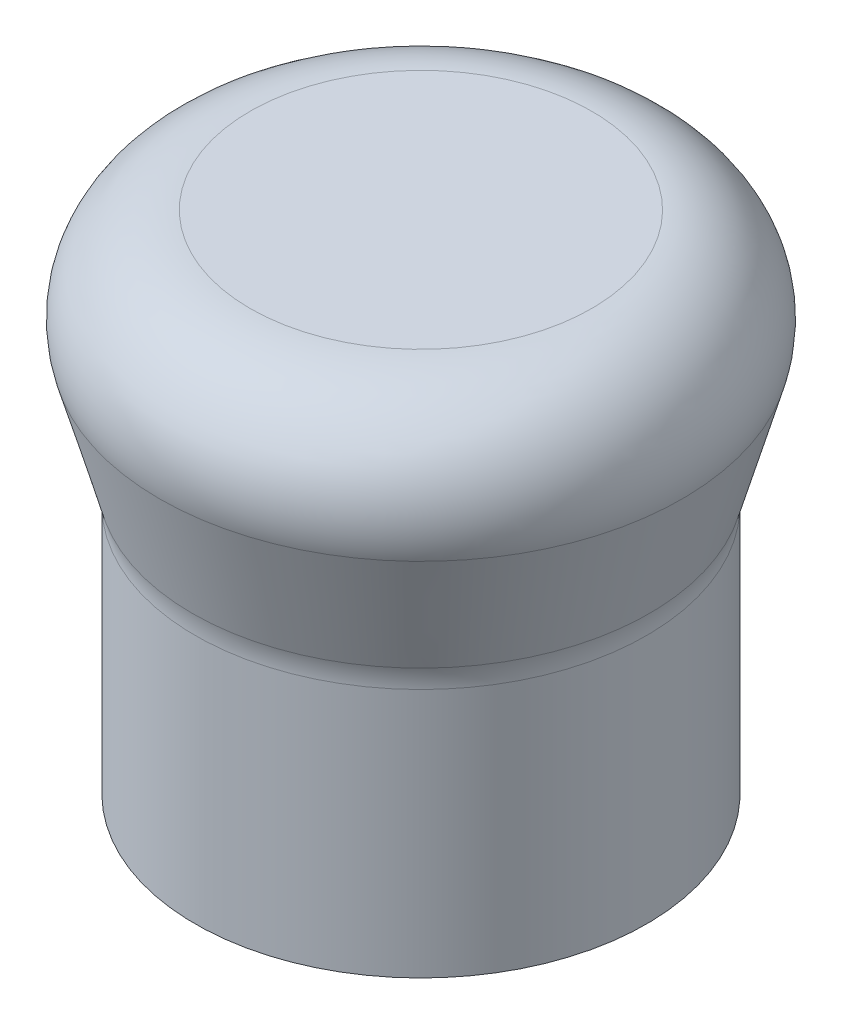
ISO-10303-21;
HEADER;
FILE_DESCRIPTION(('STEP AP214'),'2;1');
FILE_NAME('part.step','',(''),(''),'','','');
FILE_SCHEMA(('AUTOMOTIVE_DESIGN { 1 0 10303 214 1 1 1 1 }'));
ENDSEC;
DATA;
#1=APPLICATION_CONTEXT('core data for automotive mechanical design processes');
#2=APPLICATION_PROTOCOL_DEFINITION('international standard','automotive_design',2000,#1);
#3=PRODUCT_CONTEXT('',#1,'mechanical');
#4=PRODUCT('Part','Part','',(#3));
#5=PRODUCT_RELATED_PRODUCT_CATEGORY('part','',(#4));
#6=PRODUCT_DEFINITION_FORMATION('','',#4);
#7=PRODUCT_DEFINITION_CONTEXT('part definition',#1,'design');
#8=PRODUCT_DEFINITION('design','',#6,#7);
#9=PRODUCT_DEFINITION_SHAPE('','',#8);
#10=(LENGTH_UNIT() NAMED_UNIT(*) SI_UNIT(.MILLI.,.METRE.));
#11=(NAMED_UNIT(*) PLANE_ANGLE_UNIT() SI_UNIT($,.RADIAN.));
#12=(NAMED_UNIT(*) SI_UNIT($,.STERADIAN.) SOLID_ANGLE_UNIT());
#13=UNCERTAINTY_MEASURE_WITH_UNIT(LENGTH_MEASURE(1.E-05),#10,'distance_accuracy_value','');
#14=(GEOMETRIC_REPRESENTATION_CONTEXT(3) GLOBAL_UNCERTAINTY_ASSIGNED_CONTEXT((#13)) GLOBAL_UNIT_ASSIGNED_CONTEXT((#10,
#11,#12)) REPRESENTATION_CONTEXT('',''));
#15=CARTESIAN_POINT('',(0.,0.,0.));
#16=DIRECTION('',(0.,0.,1.));
#17=DIRECTION('',(1.,0.,0.));
#18=AXIS2_PLACEMENT_3D('',#15,#16,#17);
#19=CARTESIAN_POINT('',(5.,0.,0.));
#20=DIRECTION('',(0.,-1.,0.));
#21=DIRECTION('',(0.,0.,-1.));
#22=AXIS2_PLACEMENT_3D('',#19,#20,#21);
#23=PLANE('',#22);
#24=CARTESIAN_POINT('',(5.,0.,0.));
#25=DIRECTION('',(0.,-1.,0.));
#26=DIRECTION('',(0.,0.,-1.));
#27=AXIS2_PLACEMENT_3D('',#24,#25,#26);
#28=CIRCLE('',#27,5.);
#29=CARTESIAN_POINT('',(5.,0.,-5.));
#30=VERTEX_POINT('',#29);
#31=EDGE_CURVE('E122',#30,#30,#28,.T.);
#32=ORIENTED_EDGE('',*,*,#31,.F.);
#33=EDGE_LOOP('',(#32));
#34=FACE_BOUND('',#33,.T.);
#35=CARTESIAN_POINT('',(5.,0.,0.));
#36=DIRECTION('',(0.,-1.,0.));
#37=DIRECTION('',(0.,0.,-1.));
#38=AXIS2_PLACEMENT_3D('',#35,#36,#37);
#39=CIRCLE('',#38,6.);
#40=CARTESIAN_POINT('',(5.,0.,-6.));
#41=VERTEX_POINT('',#40);
#42=EDGE_CURVE('E40',#41,#41,#39,.T.);
#43=ORIENTED_EDGE('',*,*,#42,.T.);
#44=EDGE_LOOP('',(#43));
#45=FACE_BOUND('',#44,.T.);
#46=ADVANCED_FACE('F36',(#34,#45),#23,.T.);
#47=CARTESIAN_POINT('',(5.,0.,0.));
#48=DIRECTION('',(0.,-1.,0.));
#49=DIRECTION('',(0.,0.,-1.));
#50=AXIS2_PLACEMENT_3D('',#47,#48,#49);
#51=CYLINDRICAL_SURFACE('',#50,6.);
#52=CARTESIAN_POINT('',(5.,6.64305706635491,0.));
#53=DIRECTION('',(0.,-1.,0.));
#54=DIRECTION('',(0.,0.,-1.));
#55=AXIS2_PLACEMENT_3D('',#52,#53,#54);
#56=CIRCLE('',#55,6.);
#57=CARTESIAN_POINT('',(5.,6.64305706635491,-6.));
#58=VERTEX_POINT('',#57);
#59=EDGE_CURVE('E45',#58,#58,#56,.T.);
#60=ORIENTED_EDGE('',*,*,#59,.T.);
#61=EDGE_LOOP('',(#60));
#62=FACE_BOUND('',#61,.T.);
#63=ORIENTED_EDGE('',*,*,#42,.F.);
#64=EDGE_LOOP('',(#63));
#65=FACE_BOUND('',#64,.T.);
#66=ADVANCED_FACE('F71',(#62,#65),#51,.T.);
#67=CARTESIAN_POINT('',(5.,6.78748744571295,0.));
#68=DIRECTION('',(0.,1.,0.));
#69=DIRECTION('',(0.,0.,1.));
#70=AXIS2_PLACEMENT_3D('',#67,#68,#69);
#71=CONICAL_SURFACE('',#70,5.96201298726299,0.276513946617476);
#72=CARTESIAN_POINT('',(5.,7.18906443750418,0.));
#73=DIRECTION('',(0.,1.,0.));
#74=DIRECTION('',(0.,0.,1.));
#75=AXIS2_PLACEMENT_3D('',#72,#73,#74);
#76=CIRCLE('',#75,6.07597402547402);
#77=CARTESIAN_POINT('',(5.,7.18906443750418,6.07597402547402));
#78=VERTEX_POINT('',#77);
#79=EDGE_CURVE('E10',#78,#78,#76,.T.);
#80=ORIENTED_EDGE('',*,*,#79,.T.);
#81=EDGE_LOOP('',(#80));
#82=FACE_BOUND('',#81,.T.);
#83=CARTESIAN_POINT('',(5.,10.2643359762714,0.));
#84=DIRECTION('',(0.,1.,0.));
#85=DIRECTION('',(0.,0.,1.));
#86=AXIS2_PLACEMENT_3D('',#83,#84,#85);
#87=CIRCLE('',#86,6.94868621890797);
#88=CARTESIAN_POINT('',(5.,10.2643359762714,6.94868621890797));
#89=VERTEX_POINT('',#88);
#90=EDGE_CURVE('E55',#89,#89,#87,.F.);
#91=ORIENTED_EDGE('',*,*,#90,.T.);
#92=EDGE_LOOP('',(#91));
#93=FACE_BOUND('',#92,.T.);
#94=ADVANCED_FACE('F69',(#82,#93),#71,.T.);
#95=CARTESIAN_POINT('',(11.5285599356396,13.446845190208,0.));
#96=DIRECTION('',(0.,1.,0.));
#97=DIRECTION('',(0.,0.,1.));
#98=AXIS2_PLACEMENT_3D('',#95,#96,#97);
#99=PLANE('',#98);
#100=CARTESIAN_POINT('',(5.,13.446845190208,0.));
#101=DIRECTION('',(0.,1.,0.));
#102=DIRECTION('',(0.,0.,1.));
#103=AXIS2_PLACEMENT_3D('',#100,#101,#102);
#104=CIRCLE('',#103,4.54365375075049);
#105=CARTESIAN_POINT('',(5.,13.446845190208,4.54365375075049));
#106=VERTEX_POINT('',#105);
#107=EDGE_CURVE('E51',#106,#106,#104,.T.);
#108=ORIENTED_EDGE('',*,*,#107,.T.);
#109=EDGE_LOOP('',(#108));
#110=FACE_BOUND('',#109,.T.);
#111=ADVANCED_FACE('F62',(#110),#99,.T.);
#112=CARTESIAN_POINT('',(5.,10.946845190208,0.));
#113=DIRECTION('',(0.,1.,0.));
#114=DIRECTION('',(0.,0.,1.));
#115=AXIS2_PLACEMENT_3D('',#112,#113,#114);
#116=TOROIDAL_SURFACE('',#115,4.54365375075049,2.5);
#117=ORIENTED_EDGE('',*,*,#107,.F.);
#118=EDGE_LOOP('',(#117));
#119=FACE_BOUND('',#118,.T.);
#120=ORIENTED_EDGE('',*,*,#90,.F.);
#121=EDGE_LOOP('',(#120));
#122=FACE_BOUND('',#121,.T.);
#123=ADVANCED_FACE('F64',(#119,#122),#116,.T.);
#124=CARTESIAN_POINT('',(5.,6.64305706635491,0.));
#125=DIRECTION('',(0.,-1.,0.));
#126=DIRECTION('',(0.,0.,-1.));
#127=AXIS2_PLACEMENT_3D('',#124,#125,#126);
#128=TOROIDAL_SURFACE('',#127,8.,2.);
#129=ORIENTED_EDGE('',*,*,#79,.F.);
#130=EDGE_LOOP('',(#129));
#131=FACE_BOUND('',#130,.T.);
#132=ORIENTED_EDGE('',*,*,#59,.F.);
#133=EDGE_LOOP('',(#132));
#134=FACE_BOUND('',#133,.T.);
#135=ADVANCED_FACE('F38',(#131,#134),#128,.F.);
#136=CARTESIAN_POINT('',(5.,0.,0.));
#137=DIRECTION('',(0.,-1.,0.));
#138=DIRECTION('',(0.,0.,-1.));
#139=AXIS2_PLACEMENT_3D('',#136,#137,#138);
#140=CYLINDRICAL_SURFACE('',#139,5.);
#141=CARTESIAN_POINT('',(5.,6.64305706635491,0.));
#142=DIRECTION('',(0.,-1.,0.));
#143=DIRECTION('',(0.,0.,-1.));
#144=AXIS2_PLACEMENT_3D('',#141,#142,#143);
#145=CIRCLE('',#144,5.);
#146=CARTESIAN_POINT('',(5.,6.64305706635491,-5.));
#147=VERTEX_POINT('',#146);
#148=EDGE_CURVE('E113',#147,#147,#145,.T.);
#149=ORIENTED_EDGE('',*,*,#148,.F.);
#150=EDGE_LOOP('',(#149));
#151=FACE_BOUND('',#150,.T.);
#152=ORIENTED_EDGE('',*,*,#31,.T.);
#153=EDGE_LOOP('',(#152));
#154=FACE_BOUND('',#153,.T.);
#155=ADVANCED_FACE('F97',(#151,#154),#140,.F.);
#156=CARTESIAN_POINT('',(5.,7.06049113128759,0.));
#157=DIRECTION('',(0.,1.,0.));
#158=DIRECTION('',(0.,0.,1.));
#159=AXIS2_PLACEMENT_3D('',#156,#157,#158);
#160=CONICAL_SURFACE('',#159,5.,0.276513946617476);
#161=CARTESIAN_POINT('',(5.,7.46206812307881,0.));
#162=DIRECTION('',(0.,1.,0.));
#163=DIRECTION('',(0.,0.,1.));
#164=AXIS2_PLACEMENT_3D('',#161,#162,#163);
#165=CIRCLE('',#164,5.11396103821103);
#166=CARTESIAN_POINT('',(5.,7.46206812307881,5.11396103821103));
#167=VERTEX_POINT('',#166);
#168=EDGE_CURVE('E119',#167,#167,#165,.T.);
#169=ORIENTED_EDGE('',*,*,#168,.F.);
#170=EDGE_LOOP('',(#169));
#171=FACE_BOUND('',#170,.T.);
#172=CARTESIAN_POINT('',(5.,10.5373396618461,0.));
#173=DIRECTION('',(0.,-1.,0.));
#174=DIRECTION('',(0.,0.,-1.));
#175=AXIS2_PLACEMENT_3D('',#172,#173,#174);
#176=CIRCLE('',#175,5.98667323164498);
#177=CARTESIAN_POINT('',(5.,10.5373396618461,-5.98667323164498));
#178=VERTEX_POINT('',#177);
#179=EDGE_CURVE('E114',#178,#178,#176,.T.);
#180=ORIENTED_EDGE('',*,*,#179,.F.);
#181=EDGE_LOOP('',(#180));
#182=FACE_BOUND('',#181,.T.);
#183=ADVANCED_FACE('F100',(#171,#182),#160,.F.);
#184=CARTESIAN_POINT('',(11.5285599356396,12.446845190208,0.));
#185=DIRECTION('',(0.,1.,0.));
#186=DIRECTION('',(0.,0.,1.));
#187=AXIS2_PLACEMENT_3D('',#184,#185,#186);
#188=PLANE('',#187);
#189=CARTESIAN_POINT('',(5.,12.446845190208,0.));
#190=DIRECTION('',(0.,1.,0.));
#191=DIRECTION('',(0.,0.,1.));
#192=AXIS2_PLACEMENT_3D('',#189,#190,#191);
#193=CIRCLE('',#192,4.54365375075049);
#194=CARTESIAN_POINT('',(5.,12.446845190208,4.54365375075049));
#195=VERTEX_POINT('',#194);
#196=EDGE_CURVE('E111',#195,#195,#193,.T.);
#197=ORIENTED_EDGE('',*,*,#196,.F.);
#198=EDGE_LOOP('',(#197));
#199=FACE_BOUND('',#198,.T.);
#200=ADVANCED_FACE('F95',(#199),#188,.F.);
#201=CARTESIAN_POINT('',(5.,10.946845190208,0.));
#202=DIRECTION('',(0.,1.,0.));
#203=DIRECTION('',(0.,0.,1.));
#204=AXIS2_PLACEMENT_3D('',#201,#202,#203);
#205=TOROIDAL_SURFACE('',#204,4.54365375075049,1.5);
#206=ORIENTED_EDGE('',*,*,#196,.T.);
#207=EDGE_LOOP('',(#206));
#208=FACE_BOUND('',#207,.T.);
#209=ORIENTED_EDGE('',*,*,#179,.T.);
#210=EDGE_LOOP('',(#209));
#211=FACE_BOUND('',#210,.T.);
#212=ADVANCED_FACE('F91',(#208,#211),#205,.F.);
#213=CARTESIAN_POINT('',(5.,6.64305706635491,0.));
#214=DIRECTION('',(0.,-1.,0.));
#215=DIRECTION('',(0.,0.,-1.));
#216=AXIS2_PLACEMENT_3D('',#213,#214,#215);
#217=TOROIDAL_SURFACE('',#216,8.,3.);
#218=ORIENTED_EDGE('',*,*,#168,.T.);
#219=EDGE_LOOP('',(#218));
#220=FACE_BOUND('',#219,.T.);
#221=ORIENTED_EDGE('',*,*,#148,.T.);
#222=EDGE_LOOP('',(#221));
#223=FACE_BOUND('',#222,.T.);
#224=ADVANCED_FACE('F88',(#220,#223),#217,.T.);
#225=CLOSED_SHELL('',(#46,#66,#94,#111,#123,#135,#155,#183,#200,#212,#224));
#226=MANIFOLD_SOLID_BREP('B2',#225);
#227=ADVANCED_BREP_SHAPE_REPRESENTATION('',(#18,#226),#14);
#228=SHAPE_DEFINITION_REPRESENTATION(#9,#227);
ENDSEC;
END-ISO-10303-21;
